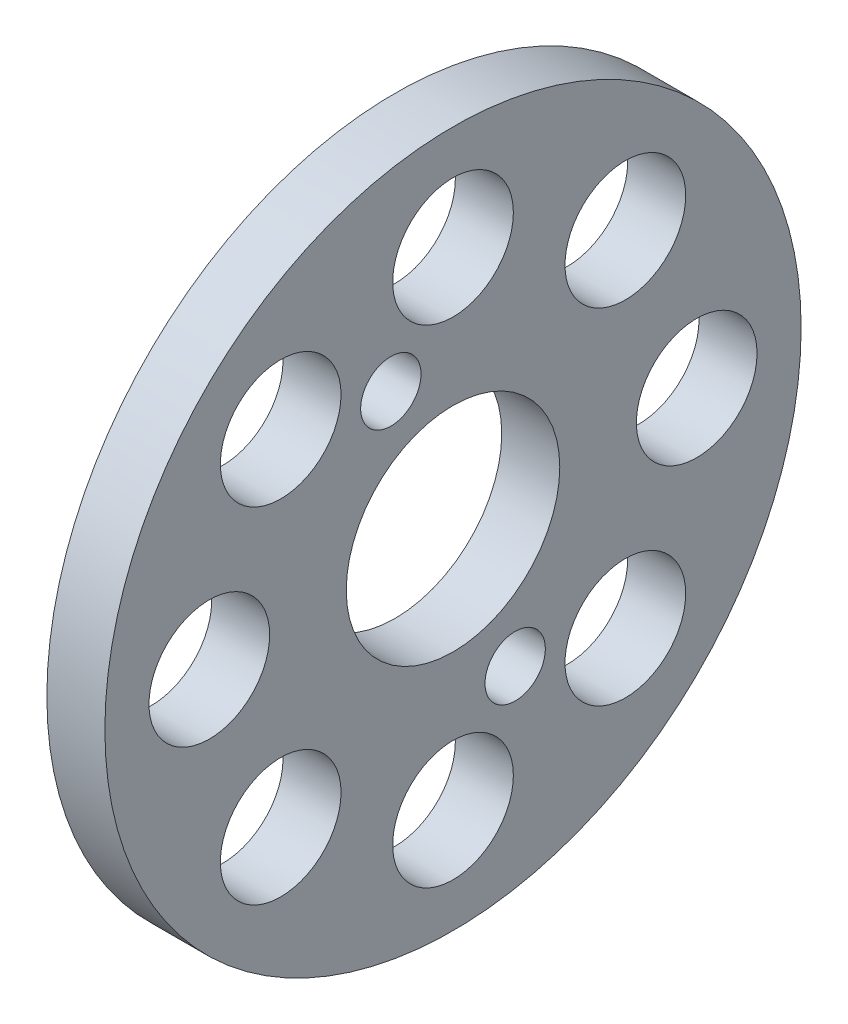
ISO-10303-21;
HEADER;
FILE_DESCRIPTION(('STEP AP214'),'2;1');
FILE_NAME('part.step','',(''),(''),'','','');
FILE_SCHEMA(('AUTOMOTIVE_DESIGN { 1 0 10303 214 1 1 1 1 }'));
ENDSEC;
DATA;
#1=APPLICATION_CONTEXT('core data for automotive mechanical design processes');
#2=APPLICATION_PROTOCOL_DEFINITION('international standard','automotive_design',2000,#1);
#3=PRODUCT_CONTEXT('',#1,'mechanical');
#4=PRODUCT('Part','Part','',(#3));
#5=PRODUCT_RELATED_PRODUCT_CATEGORY('part','',(#4));
#6=PRODUCT_DEFINITION_FORMATION('','',#4);
#7=PRODUCT_DEFINITION_CONTEXT('part definition',#1,'design');
#8=PRODUCT_DEFINITION('design','',#6,#7);
#9=PRODUCT_DEFINITION_SHAPE('','',#8);
#10=(LENGTH_UNIT() NAMED_UNIT(*) SI_UNIT(.MILLI.,.METRE.));
#11=(NAMED_UNIT(*) PLANE_ANGLE_UNIT() SI_UNIT($,.RADIAN.));
#12=(NAMED_UNIT(*) SI_UNIT($,.STERADIAN.) SOLID_ANGLE_UNIT());
#13=UNCERTAINTY_MEASURE_WITH_UNIT(LENGTH_MEASURE(1.E-05),#10,'distance_accuracy_value','');
#14=(GEOMETRIC_REPRESENTATION_CONTEXT(3) GLOBAL_UNCERTAINTY_ASSIGNED_CONTEXT((#13)) GLOBAL_UNIT_ASSIGNED_CONTEXT((#10,
#11,#12)) REPRESENTATION_CONTEXT('',''));
#15=CARTESIAN_POINT('',(0.,0.,0.));
#16=DIRECTION('',(0.,0.,1.));
#17=DIRECTION('',(1.,0.,0.));
#18=AXIS2_PLACEMENT_3D('',#15,#16,#17);
#19=CARTESIAN_POINT('',(143.7,30.,0.));
#20=DIRECTION('',(1.,0.,0.));
#21=DIRECTION('',(0.,0.,-1.));
#22=AXIS2_PLACEMENT_3D('',#19,#20,#21);
#23=PLANE('',#22);
#24=CARTESIAN_POINT('',(143.7,12.934313455158,5.35756805311126));
#25=DIRECTION('',(1.,0.,0.));
#26=DIRECTION('',(0.,0.,-1.));
#27=AXIS2_PLACEMENT_3D('',#24,#25,#26);
#28=CIRCLE('',#27,2.6);
#29=CARTESIAN_POINT('',(143.7,12.934313455158,2.75756805311126));
#30=VERTEX_POINT('',#29);
#31=EDGE_CURVE('E60',#30,#30,#28,.F.);
#32=ORIENTED_EDGE('',*,*,#31,.F.);
#33=EDGE_LOOP('',(#32));
#34=FACE_BOUND('',#33,.T.);
#35=CARTESIAN_POINT('',(143.7,14.8492424049175,-14.8492424049175));
#36=DIRECTION('',(1.,0.,0.));
#37=DIRECTION('',(0.,0.,-1.));
#38=AXIS2_PLACEMENT_3D('',#35,#36,#37);
#39=CIRCLE('',#38,5.2);
#40=CARTESIAN_POINT('',(143.7,14.8492424049175,-20.0492424049175));
#41=VERTEX_POINT('',#40);
#42=EDGE_CURVE('E64',#41,#41,#39,.F.);
#43=ORIENTED_EDGE('',*,*,#42,.F.);
#44=EDGE_LOOP('',(#43));
#45=FACE_BOUND('',#44,.T.);
#46=CARTESIAN_POINT('',(143.7,0.,-21.));
#47=DIRECTION('',(1.,0.,0.));
#48=DIRECTION('',(0.,0.,-1.));
#49=AXIS2_PLACEMENT_3D('',#46,#47,#48);
#50=CIRCLE('',#49,5.2);
#51=CARTESIAN_POINT('',(143.7,0.,-26.2));
#52=VERTEX_POINT('',#51);
#53=EDGE_CURVE('E68',#52,#52,#50,.F.);
#54=ORIENTED_EDGE('',*,*,#53,.F.);
#55=EDGE_LOOP('',(#54));
#56=FACE_BOUND('',#55,.T.);
#57=CARTESIAN_POINT('',(143.7,-14.8492424049175,-14.8492424049175));
#58=DIRECTION('',(1.,0.,0.));
#59=DIRECTION('',(0.,0.,-1.));
#60=AXIS2_PLACEMENT_3D('',#57,#58,#59);
#61=CIRCLE('',#60,5.2);
#62=CARTESIAN_POINT('',(143.7,-14.8492424049175,-20.0492424049175));
#63=VERTEX_POINT('',#62);
#64=EDGE_CURVE('E72',#63,#63,#61,.F.);
#65=ORIENTED_EDGE('',*,*,#64,.F.);
#66=EDGE_LOOP('',(#65));
#67=FACE_BOUND('',#66,.T.);
#68=CARTESIAN_POINT('',(143.7,-21.,0.));
#69=DIRECTION('',(1.,0.,0.));
#70=DIRECTION('',(0.,0.,-1.));
#71=AXIS2_PLACEMENT_3D('',#68,#69,#70);
#72=CIRCLE('',#71,5.2);
#73=CARTESIAN_POINT('',(143.7,-21.,-5.2));
#74=VERTEX_POINT('',#73);
#75=EDGE_CURVE('E76',#74,#74,#72,.F.);
#76=ORIENTED_EDGE('',*,*,#75,.F.);
#77=EDGE_LOOP('',(#76));
#78=FACE_BOUND('',#77,.T.);
#79=CARTESIAN_POINT('',(143.7,-14.8492424049175,14.8492424049175));
#80=DIRECTION('',(1.,0.,0.));
#81=DIRECTION('',(0.,0.,-1.));
#82=AXIS2_PLACEMENT_3D('',#79,#80,#81);
#83=CIRCLE('',#82,5.2);
#84=CARTESIAN_POINT('',(143.7,-14.8492424049175,9.6492424049175));
#85=VERTEX_POINT('',#84);
#86=EDGE_CURVE('E80',#85,#85,#83,.F.);
#87=ORIENTED_EDGE('',*,*,#86,.F.);
#88=EDGE_LOOP('',(#87));
#89=FACE_BOUND('',#88,.T.);
#90=CARTESIAN_POINT('',(143.7,0.,21.));
#91=DIRECTION('',(1.,0.,0.));
#92=DIRECTION('',(0.,0.,-1.));
#93=AXIS2_PLACEMENT_3D('',#90,#91,#92);
#94=CIRCLE('',#93,5.2);
#95=CARTESIAN_POINT('',(143.7,0.,15.8));
#96=VERTEX_POINT('',#95);
#97=EDGE_CURVE('E84',#96,#96,#94,.F.);
#98=ORIENTED_EDGE('',*,*,#97,.F.);
#99=EDGE_LOOP('',(#98));
#100=FACE_BOUND('',#99,.T.);
#101=CARTESIAN_POINT('',(143.7,14.8492424049175,14.8492424049175));
#102=DIRECTION('',(1.,0.,0.));
#103=DIRECTION('',(0.,0.,-1.));
#104=AXIS2_PLACEMENT_3D('',#101,#102,#103);
#105=CIRCLE('',#104,5.2);
#106=CARTESIAN_POINT('',(143.7,14.8492424049175,9.6492424049175));
#107=VERTEX_POINT('',#106);
#108=EDGE_CURVE('E88',#107,#107,#105,.F.);
#109=ORIENTED_EDGE('',*,*,#108,.F.);
#110=EDGE_LOOP('',(#109));
#111=FACE_BOUND('',#110,.T.);
#112=CARTESIAN_POINT('',(143.7,-12.934313455158,-5.35756805311126));
#113=DIRECTION('',(1.,0.,0.));
#114=DIRECTION('',(0.,0.,-1.));
#115=AXIS2_PLACEMENT_3D('',#112,#113,#114);
#116=CIRCLE('',#115,2.6);
#117=CARTESIAN_POINT('',(143.7,-12.934313455158,-7.95756805311126));
#118=VERTEX_POINT('',#117);
#119=EDGE_CURVE('E92',#118,#118,#116,.F.);
#120=ORIENTED_EDGE('',*,*,#119,.F.);
#121=EDGE_LOOP('',(#120));
#122=FACE_BOUND('',#121,.T.);
#123=CARTESIAN_POINT('',(143.7,21.,0.));
#124=DIRECTION('',(1.,0.,0.));
#125=DIRECTION('',(0.,0.,-1.));
#126=AXIS2_PLACEMENT_3D('',#123,#124,#125);
#127=CIRCLE('',#126,5.2);
#128=CARTESIAN_POINT('',(143.7,21.,-5.2));
#129=VERTEX_POINT('',#128);
#130=EDGE_CURVE('E96',#129,#129,#127,.F.);
#131=ORIENTED_EDGE('',*,*,#130,.F.);
#132=EDGE_LOOP('',(#131));
#133=FACE_BOUND('',#132,.T.);
#134=CARTESIAN_POINT('',(143.7,0.,0.));
#135=DIRECTION('',(-1.,0.,0.));
#136=DIRECTION('',(0.,0.,1.));
#137=AXIS2_PLACEMENT_3D('',#134,#135,#136);
#138=CIRCLE('',#137,9.2);
#139=CARTESIAN_POINT('',(143.7,0.,9.2));
#140=VERTEX_POINT('',#139);
#141=EDGE_CURVE('E10',#140,#140,#138,.T.);
#142=ORIENTED_EDGE('',*,*,#141,.F.);
#143=EDGE_LOOP('',(#142));
#144=FACE_BOUND('',#143,.T.);
#145=CARTESIAN_POINT('',(143.7,0.,0.));
#146=DIRECTION('',(-1.,0.,0.));
#147=DIRECTION('',(0.,0.,1.));
#148=AXIS2_PLACEMENT_3D('',#145,#146,#147);
#149=CIRCLE('',#148,30.);
#150=CARTESIAN_POINT('',(143.7,0.,30.));
#151=VERTEX_POINT('',#150);
#152=EDGE_CURVE('E54',#151,#151,#149,.T.);
#153=ORIENTED_EDGE('',*,*,#152,.T.);
#154=EDGE_LOOP('',(#153));
#155=FACE_BOUND('',#154,.T.);
#156=ADVANCED_FACE('F37',(#34,#45,#56,#67,#78,#89,#100,#111,#122,#133,#144,#155),#23,.F.);
#157=CARTESIAN_POINT('',(-110.,0.,0.));
#158=DIRECTION('',(-1.,0.,0.));
#159=DIRECTION('',(0.,0.,1.));
#160=AXIS2_PLACEMENT_3D('',#157,#158,#159);
#161=CYLINDRICAL_SURFACE('',#160,9.2);
#162=CARTESIAN_POINT('',(148.7,0.,0.));
#163=DIRECTION('',(-1.,0.,0.));
#164=DIRECTION('',(0.,0.,1.));
#165=AXIS2_PLACEMENT_3D('',#162,#163,#164);
#166=CIRCLE('',#165,9.2);
#167=CARTESIAN_POINT('',(148.7,0.,9.2));
#168=VERTEX_POINT('',#167);
#169=EDGE_CURVE('E44',#168,#168,#166,.T.);
#170=ORIENTED_EDGE('',*,*,#169,.F.);
#171=EDGE_LOOP('',(#170));
#172=FACE_BOUND('',#171,.T.);
#173=ORIENTED_EDGE('',*,*,#141,.T.);
#174=EDGE_LOOP('',(#173));
#175=FACE_BOUND('',#174,.T.);
#176=ADVANCED_FACE('F148',(#172,#175),#161,.F.);
#177=CARTESIAN_POINT('',(148.7,9.2,0.));
#178=DIRECTION('',(-1.,0.,0.));
#179=DIRECTION('',(0.,0.,1.));
#180=AXIS2_PLACEMENT_3D('',#177,#178,#179);
#181=PLANE('',#180);
#182=CARTESIAN_POINT('',(148.7,12.934313455158,5.35756805311126));
#183=DIRECTION('',(1.,0.,0.));
#184=DIRECTION('',(0.,0.,-1.));
#185=AXIS2_PLACEMENT_3D('',#182,#183,#184);
#186=CIRCLE('',#185,2.6);
#187=CARTESIAN_POINT('',(148.7,12.934313455158,2.75756805311126));
#188=VERTEX_POINT('',#187);
#189=EDGE_CURVE('E121',#188,#188,#186,.T.);
#190=ORIENTED_EDGE('',*,*,#189,.F.);
#191=EDGE_LOOP('',(#190));
#192=FACE_BOUND('',#191,.T.);
#193=CARTESIAN_POINT('',(148.7,14.8492424049175,-14.8492424049175));
#194=DIRECTION('',(1.,0.,0.));
#195=DIRECTION('',(0.,0.,-1.));
#196=AXIS2_PLACEMENT_3D('',#193,#194,#195);
#197=CIRCLE('',#196,5.2);
#198=CARTESIAN_POINT('',(148.7,14.8492424049175,-20.0492424049175));
#199=VERTEX_POINT('',#198);
#200=EDGE_CURVE('E125',#199,#199,#197,.T.);
#201=ORIENTED_EDGE('',*,*,#200,.F.);
#202=EDGE_LOOP('',(#201));
#203=FACE_BOUND('',#202,.T.);
#204=CARTESIAN_POINT('',(148.7,0.,-21.));
#205=DIRECTION('',(1.,0.,0.));
#206=DIRECTION('',(0.,0.,-1.));
#207=AXIS2_PLACEMENT_3D('',#204,#205,#206);
#208=CIRCLE('',#207,5.2);
#209=CARTESIAN_POINT('',(148.7,0.,-26.2));
#210=VERTEX_POINT('',#209);
#211=EDGE_CURVE('E130',#210,#210,#208,.T.);
#212=ORIENTED_EDGE('',*,*,#211,.F.);
#213=EDGE_LOOP('',(#212));
#214=FACE_BOUND('',#213,.T.);
#215=CARTESIAN_POINT('',(148.7,-14.8492424049175,-14.8492424049175));
#216=DIRECTION('',(1.,0.,0.));
#217=DIRECTION('',(0.,0.,-1.));
#218=AXIS2_PLACEMENT_3D('',#215,#216,#217);
#219=CIRCLE('',#218,5.2);
#220=CARTESIAN_POINT('',(148.7,-14.8492424049175,-20.0492424049175));
#221=VERTEX_POINT('',#220);
#222=EDGE_CURVE('E110',#221,#221,#219,.T.);
#223=ORIENTED_EDGE('',*,*,#222,.F.);
#224=EDGE_LOOP('',(#223));
#225=FACE_BOUND('',#224,.T.);
#226=CARTESIAN_POINT('',(148.7,-21.,0.));
#227=DIRECTION('',(1.,0.,0.));
#228=DIRECTION('',(0.,0.,-1.));
#229=AXIS2_PLACEMENT_3D('',#226,#227,#228);
#230=CIRCLE('',#229,5.2);
#231=CARTESIAN_POINT('',(148.7,-21.,-5.2));
#232=VERTEX_POINT('',#231);
#233=EDGE_CURVE('E105',#232,#232,#230,.T.);
#234=ORIENTED_EDGE('',*,*,#233,.F.);
#235=EDGE_LOOP('',(#234));
#236=FACE_BOUND('',#235,.T.);
#237=CARTESIAN_POINT('',(148.7,-14.8492424049175,14.8492424049175));
#238=DIRECTION('',(1.,0.,0.));
#239=DIRECTION('',(0.,0.,-1.));
#240=AXIS2_PLACEMENT_3D('',#237,#238,#239);
#241=CIRCLE('',#240,5.2);
#242=CARTESIAN_POINT('',(148.7,-14.8492424049175,9.6492424049175));
#243=VERTEX_POINT('',#242);
#244=EDGE_CURVE('E109',#243,#243,#241,.T.);
#245=ORIENTED_EDGE('',*,*,#244,.F.);
#246=EDGE_LOOP('',(#245));
#247=FACE_BOUND('',#246,.T.);
#248=CARTESIAN_POINT('',(148.7,0.,21.));
#249=DIRECTION('',(1.,0.,0.));
#250=DIRECTION('',(0.,0.,-1.));
#251=AXIS2_PLACEMENT_3D('',#248,#249,#250);
#252=CIRCLE('',#251,5.2);
#253=CARTESIAN_POINT('',(148.7,0.,15.8));
#254=VERTEX_POINT('',#253);
#255=EDGE_CURVE('E114',#254,#254,#252,.T.);
#256=ORIENTED_EDGE('',*,*,#255,.F.);
#257=EDGE_LOOP('',(#256));
#258=FACE_BOUND('',#257,.T.);
#259=CARTESIAN_POINT('',(148.7,14.8492424049175,14.8492424049175));
#260=DIRECTION('',(1.,0.,0.));
#261=DIRECTION('',(0.,0.,-1.));
#262=AXIS2_PLACEMENT_3D('',#259,#260,#261);
#263=CIRCLE('',#262,5.2);
#264=CARTESIAN_POINT('',(148.7,14.8492424049175,9.6492424049175));
#265=VERTEX_POINT('',#264);
#266=EDGE_CURVE('E104',#265,#265,#263,.T.);
#267=ORIENTED_EDGE('',*,*,#266,.F.);
#268=EDGE_LOOP('',(#267));
#269=FACE_BOUND('',#268,.T.);
#270=CARTESIAN_POINT('',(148.7,-12.934313455158,-5.35756805311126));
#271=DIRECTION('',(1.,0.,0.));
#272=DIRECTION('',(0.,0.,-1.));
#273=AXIS2_PLACEMENT_3D('',#270,#271,#272);
#274=CIRCLE('',#273,2.6);
#275=CARTESIAN_POINT('',(148.7,-12.934313455158,-7.95756805311126));
#276=VERTEX_POINT('',#275);
#277=EDGE_CURVE('E126',#276,#276,#274,.T.);
#278=ORIENTED_EDGE('',*,*,#277,.F.);
#279=EDGE_LOOP('',(#278));
#280=FACE_BOUND('',#279,.T.);
#281=CARTESIAN_POINT('',(148.7,21.,0.));
#282=DIRECTION('',(1.,0.,0.));
#283=DIRECTION('',(0.,0.,-1.));
#284=AXIS2_PLACEMENT_3D('',#281,#282,#283);
#285=CIRCLE('',#284,5.2);
#286=CARTESIAN_POINT('',(148.7,21.,-5.2));
#287=VERTEX_POINT('',#286);
#288=EDGE_CURVE('E100',#287,#287,#285,.T.);
#289=ORIENTED_EDGE('',*,*,#288,.F.);
#290=EDGE_LOOP('',(#289));
#291=FACE_BOUND('',#290,.T.);
#292=CARTESIAN_POINT('',(148.7,0.,0.));
#293=DIRECTION('',(-1.,0.,0.));
#294=DIRECTION('',(0.,0.,1.));
#295=AXIS2_PLACEMENT_3D('',#292,#293,#294);
#296=CIRCLE('',#295,30.);
#297=CARTESIAN_POINT('',(148.7,0.,30.));
#298=VERTEX_POINT('',#297);
#299=EDGE_CURVE('E49',#298,#298,#296,.T.);
#300=ORIENTED_EDGE('',*,*,#299,.F.);
#301=EDGE_LOOP('',(#300));
#302=FACE_BOUND('',#301,.T.);
#303=ORIENTED_EDGE('',*,*,#169,.T.);
#304=EDGE_LOOP('',(#303));
#305=FACE_BOUND('',#304,.T.);
#306=ADVANCED_FACE('F144',(#192,#203,#214,#225,#236,#247,#258,#269,#280,#291,#302,#305),#181,.F.);
#307=CARTESIAN_POINT('',(-110.,0.,0.));
#308=DIRECTION('',(-1.,0.,0.));
#309=DIRECTION('',(0.,0.,1.));
#310=AXIS2_PLACEMENT_3D('',#307,#308,#309);
#311=CYLINDRICAL_SURFACE('',#310,30.);
#312=ORIENTED_EDGE('',*,*,#152,.F.);
#313=EDGE_LOOP('',(#312));
#314=FACE_BOUND('',#313,.T.);
#315=ORIENTED_EDGE('',*,*,#299,.T.);
#316=EDGE_LOOP('',(#315));
#317=FACE_BOUND('',#316,.T.);
#318=ADVANCED_FACE('F147',(#314,#317),#311,.T.);
#319=CARTESIAN_POINT('',(143.7,21.,0.));
#320=DIRECTION('',(-1.,0.,0.));
#321=DIRECTION('',(0.,0.,1.));
#322=AXIS2_PLACEMENT_3D('',#319,#320,#321);
#323=CYLINDRICAL_SURFACE('',#322,5.2);
#324=ORIENTED_EDGE('',*,*,#288,.T.);
#325=EDGE_LOOP('',(#324));
#326=FACE_BOUND('',#325,.T.);
#327=ORIENTED_EDGE('',*,*,#130,.T.);
#328=EDGE_LOOP('',(#327));
#329=FACE_BOUND('',#328,.T.);
#330=ADVANCED_FACE('F156',(#326,#329),#323,.F.);
#331=CARTESIAN_POINT('',(143.7,-12.934313455158,-5.35756805311126));
#332=DIRECTION('',(-1.,0.,0.));
#333=DIRECTION('',(0.,0.,1.));
#334=AXIS2_PLACEMENT_3D('',#331,#332,#333);
#335=CYLINDRICAL_SURFACE('',#334,2.6);
#336=ORIENTED_EDGE('',*,*,#277,.T.);
#337=EDGE_LOOP('',(#336));
#338=FACE_BOUND('',#337,.T.);
#339=ORIENTED_EDGE('',*,*,#119,.T.);
#340=EDGE_LOOP('',(#339));
#341=FACE_BOUND('',#340,.T.);
#342=ADVANCED_FACE('F141',(#338,#341),#335,.F.);
#343=CARTESIAN_POINT('',(143.7,14.8492424049175,14.8492424049175));
#344=DIRECTION('',(-1.,0.,0.));
#345=DIRECTION('',(0.,0.,1.));
#346=AXIS2_PLACEMENT_3D('',#343,#344,#345);
#347=CYLINDRICAL_SURFACE('',#346,5.2);
#348=ORIENTED_EDGE('',*,*,#266,.T.);
#349=EDGE_LOOP('',(#348));
#350=FACE_BOUND('',#349,.T.);
#351=ORIENTED_EDGE('',*,*,#108,.T.);
#352=EDGE_LOOP('',(#351));
#353=FACE_BOUND('',#352,.T.);
#354=ADVANCED_FACE('F194',(#350,#353),#347,.F.);
#355=CARTESIAN_POINT('',(143.7,0.,21.));
#356=DIRECTION('',(-1.,0.,0.));
#357=DIRECTION('',(0.,0.,1.));
#358=AXIS2_PLACEMENT_3D('',#355,#356,#357);
#359=CYLINDRICAL_SURFACE('',#358,5.2);
#360=ORIENTED_EDGE('',*,*,#255,.T.);
#361=EDGE_LOOP('',(#360));
#362=FACE_BOUND('',#361,.T.);
#363=ORIENTED_EDGE('',*,*,#97,.T.);
#364=EDGE_LOOP('',(#363));
#365=FACE_BOUND('',#364,.T.);
#366=ADVANCED_FACE('F199',(#362,#365),#359,.F.);
#367=CARTESIAN_POINT('',(143.7,-14.8492424049175,14.8492424049175));
#368=DIRECTION('',(-1.,0.,0.));
#369=DIRECTION('',(0.,0.,1.));
#370=AXIS2_PLACEMENT_3D('',#367,#368,#369);
#371=CYLINDRICAL_SURFACE('',#370,5.2);
#372=ORIENTED_EDGE('',*,*,#244,.T.);
#373=EDGE_LOOP('',(#372));
#374=FACE_BOUND('',#373,.T.);
#375=ORIENTED_EDGE('',*,*,#86,.T.);
#376=EDGE_LOOP('',(#375));
#377=FACE_BOUND('',#376,.T.);
#378=ADVANCED_FACE('F222',(#374,#377),#371,.F.);
#379=CARTESIAN_POINT('',(143.7,-21.,0.));
#380=DIRECTION('',(-1.,0.,0.));
#381=DIRECTION('',(0.,0.,1.));
#382=AXIS2_PLACEMENT_3D('',#379,#380,#381);
#383=CYLINDRICAL_SURFACE('',#382,5.2);
#384=ORIENTED_EDGE('',*,*,#233,.T.);
#385=EDGE_LOOP('',(#384));
#386=FACE_BOUND('',#385,.T.);
#387=ORIENTED_EDGE('',*,*,#75,.T.);
#388=EDGE_LOOP('',(#387));
#389=FACE_BOUND('',#388,.T.);
#390=ADVANCED_FACE('F207',(#386,#389),#383,.F.);
#391=CARTESIAN_POINT('',(143.7,-14.8492424049175,-14.8492424049175));
#392=DIRECTION('',(-1.,0.,0.));
#393=DIRECTION('',(0.,0.,1.));
#394=AXIS2_PLACEMENT_3D('',#391,#392,#393);
#395=CYLINDRICAL_SURFACE('',#394,5.2);
#396=ORIENTED_EDGE('',*,*,#222,.T.);
#397=EDGE_LOOP('',(#396));
#398=FACE_BOUND('',#397,.T.);
#399=ORIENTED_EDGE('',*,*,#64,.T.);
#400=EDGE_LOOP('',(#399));
#401=FACE_BOUND('',#400,.T.);
#402=ADVANCED_FACE('F203',(#398,#401),#395,.F.);
#403=CARTESIAN_POINT('',(143.7,0.,-21.));
#404=DIRECTION('',(-1.,0.,0.));
#405=DIRECTION('',(0.,0.,1.));
#406=AXIS2_PLACEMENT_3D('',#403,#404,#405);
#407=CYLINDRICAL_SURFACE('',#406,5.2);
#408=ORIENTED_EDGE('',*,*,#211,.T.);
#409=EDGE_LOOP('',(#408));
#410=FACE_BOUND('',#409,.T.);
#411=ORIENTED_EDGE('',*,*,#53,.T.);
#412=EDGE_LOOP('',(#411));
#413=FACE_BOUND('',#412,.T.);
#414=ADVANCED_FACE('F206',(#410,#413),#407,.F.);
#415=CARTESIAN_POINT('',(143.7,14.8492424049175,-14.8492424049175));
#416=DIRECTION('',(-1.,0.,0.));
#417=DIRECTION('',(0.,0.,1.));
#418=AXIS2_PLACEMENT_3D('',#415,#416,#417);
#419=CYLINDRICAL_SURFACE('',#418,5.2);
#420=ORIENTED_EDGE('',*,*,#200,.T.);
#421=EDGE_LOOP('',(#420));
#422=FACE_BOUND('',#421,.T.);
#423=ORIENTED_EDGE('',*,*,#42,.T.);
#424=EDGE_LOOP('',(#423));
#425=FACE_BOUND('',#424,.T.);
#426=ADVANCED_FACE('F211',(#422,#425),#419,.F.);
#427=CARTESIAN_POINT('',(143.7,12.934313455158,5.35756805311126));
#428=DIRECTION('',(-1.,0.,0.));
#429=DIRECTION('',(0.,0.,1.));
#430=AXIS2_PLACEMENT_3D('',#427,#428,#429);
#431=CYLINDRICAL_SURFACE('',#430,2.6);
#432=ORIENTED_EDGE('',*,*,#189,.T.);
#433=EDGE_LOOP('',(#432));
#434=FACE_BOUND('',#433,.T.);
#435=ORIENTED_EDGE('',*,*,#31,.T.);
#436=EDGE_LOOP('',(#435));
#437=FACE_BOUND('',#436,.T.);
#438=ADVANCED_FACE('F215',(#434,#437),#431,.F.);
#439=CLOSED_SHELL('',(#156,#176,#306,#318,#330,#342,#354,#366,#378,#390,#402,#414,#426,#438));
#440=MANIFOLD_SOLID_BREP('B2',#439);
#441=ADVANCED_BREP_SHAPE_REPRESENTATION('',(#18,#440),#14);
#442=SHAPE_DEFINITION_REPRESENTATION(#9,#441);
ENDSEC;
END-ISO-10303-21;
